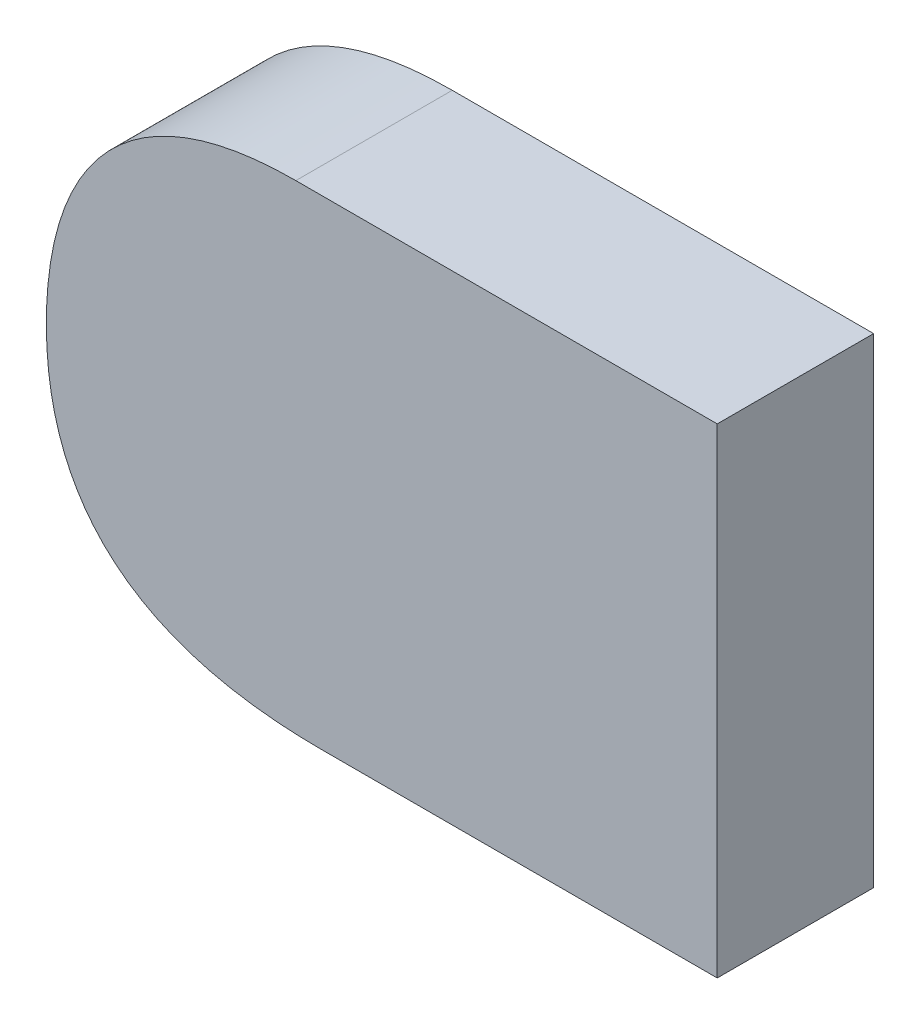
ISO-10303-21;
HEADER;
FILE_DESCRIPTION(('STEP AP214'),'2;1');
FILE_NAME('part.step','',(''),(''),'','','');
FILE_SCHEMA(('AUTOMOTIVE_DESIGN { 1 0 10303 214 1 1 1 1 }'));
ENDSEC;
DATA;
#1=APPLICATION_CONTEXT('core data for automotive mechanical design processes');
#2=APPLICATION_PROTOCOL_DEFINITION('international standard','automotive_design',2000,#1);
#3=PRODUCT_CONTEXT('',#1,'mechanical');
#4=PRODUCT('Part','Part','',(#3));
#5=PRODUCT_RELATED_PRODUCT_CATEGORY('part','',(#4));
#6=PRODUCT_DEFINITION_FORMATION('','',#4);
#7=PRODUCT_DEFINITION_CONTEXT('part definition',#1,'design');
#8=PRODUCT_DEFINITION('design','',#6,#7);
#9=PRODUCT_DEFINITION_SHAPE('','',#8);
#10=(LENGTH_UNIT() NAMED_UNIT(*) SI_UNIT(.MILLI.,.METRE.));
#11=(NAMED_UNIT(*) PLANE_ANGLE_UNIT() SI_UNIT($,.RADIAN.));
#12=(NAMED_UNIT(*) SI_UNIT($,.STERADIAN.) SOLID_ANGLE_UNIT());
#13=UNCERTAINTY_MEASURE_WITH_UNIT(LENGTH_MEASURE(1.E-05),#10,'distance_accuracy_value','');
#14=(GEOMETRIC_REPRESENTATION_CONTEXT(3) GLOBAL_UNCERTAINTY_ASSIGNED_CONTEXT((#13)) GLOBAL_UNIT_ASSIGNED_CONTEXT((#10,
#11,#12)) REPRESENTATION_CONTEXT('',''));
#15=CARTESIAN_POINT('',(0.,0.,0.));
#16=DIRECTION('',(0.,0.,1.));
#17=DIRECTION('',(1.,0.,0.));
#18=AXIS2_PLACEMENT_3D('',#15,#16,#17);
#19=CARTESIAN_POINT('',(-24.24255021043,3.656604873158,19.2));
#20=DIRECTION('',(0.,0.,1.));
#21=DIRECTION('',(1.,0.,0.));
#22=AXIS2_PLACEMENT_3D('',#19,#20,#21);
#23=PLANE('',#22);
#24=DIRECTION('',(1.,0.,0.));
#25=VECTOR('',#24,1.);
#26=CARTESIAN_POINT('',(-24.71358248636,2.134115071921,19.2));
#27=LINE('',#26,#25);
#28=CARTESIAN_POINT('',(-24.71358248636,2.134115071921,19.2));
#29=VERTEX_POINT('',#28);
#30=CARTESIAN_POINT('',(-22.18731541969,2.13411538542482,19.2));
#31=VERTEX_POINT('',#30);
#32=EDGE_CURVE('E27',#29,#31,#27,.T.);
#33=ORIENTED_EDGE('',*,*,#32,.F.);
#34=CARTESIAN_POINT('',(35.2406784290266,53.8203882570304,19.2));
#35=DIRECTION('',(0.,0.,1.));
#36=DIRECTION('',(0.768285049798114,0.640107867672871,0.));
#37=AXIS2_PLACEMENT_3D('',#34,#35,#36);
#38=ELLIPSE('',#37,79.943656208256,9.46145339615795);
#39=CARTESIAN_POINT('',(-26.47671219747,3.607464649699,19.2));
#40=VERTEX_POINT('',#39);
#41=EDGE_CURVE('E93',#40,#29,#38,.T.);
#42=ORIENTED_EDGE('',*,*,#41,.F.);
#43=CARTESIAN_POINT('',(-24.88156115303,5.202285494143,19.2));
#44=CARTESIAN_POINT('',(-25.94122939747,5.202285494143,19.2));
#45=CARTESIAN_POINT('',(-26.47671219747,4.581726805254,19.2));
#46=CARTESIAN_POINT('',(-26.47671219747,3.607464649699,19.2));
#47=(BOUNDED_CURVE() B_SPLINE_CURVE(3,(#43,#44,#45,#46),.UNSPECIFIED.,.F.,
.F.) B_SPLINE_CURVE_WITH_KNOTS((4,4),(0.,1.),
.UNSPECIFIED.) CURVE() GEOMETRIC_REPRESENTATION_ITEM() RATIONAL_B_SPLINE_CURVE((1.,1.,1.,1.)) REPRESENTATION_ITEM(''));
#48=CARTESIAN_POINT('',(-24.88156115303,5.202285494143,19.2));
#49=VERTEX_POINT('',#48);
#50=EDGE_CURVE('E91',#49,#40,#47,.T.);
#51=ORIENTED_EDGE('',*,*,#50,.F.);
#52=DIRECTION('',(-1.,0.,0.));
#53=VECTOR('',#52,1.);
#54=CARTESIAN_POINT('',(-22.18731541969,5.202285494143,19.2));
#55=LINE('',#54,#53);
#56=CARTESIAN_POINT('',(-22.18731541969,5.202285494143,19.2));
#57=VERTEX_POINT('',#56);
#58=EDGE_CURVE('E56',#57,#49,#55,.T.);
#59=ORIENTED_EDGE('',*,*,#58,.F.);
#60=DIRECTION('',(0.,1.,0.));
#61=VECTOR('',#60,1.);
#62=CARTESIAN_POINT('',(-22.18731541969,2.134117894143,19.2));
#63=LINE('',#62,#61);
#64=EDGE_CURVE('E120',#31,#57,#63,.T.);
#65=ORIENTED_EDGE('',*,*,#64,.F.);
#66=EDGE_LOOP('',(#33,#42,#51,#59,#65));
#67=FACE_BOUND('',#66,.T.);
#68=ADVANCED_FACE('F16',(#67),#23,.F.);
#69=CARTESIAN_POINT('',(-24.24255021043,3.656604873158,20.2));
#70=DIRECTION('',(0.,0.,1.));
#71=DIRECTION('',(1.,0.,0.));
#72=AXIS2_PLACEMENT_3D('',#69,#70,#71);
#73=PLANE('',#72);
#74=DIRECTION('',(0.,1.,0.));
#75=VECTOR('',#74,1.);
#76=CARTESIAN_POINT('',(-22.18731541969,2.134117894143,20.2));
#77=LINE('',#76,#75);
#78=CARTESIAN_POINT('',(-22.18731541969,2.13411538542467,20.2));
#79=VERTEX_POINT('',#78);
#80=CARTESIAN_POINT('',(-22.18731541969,5.202285494143,20.2));
#81=VERTEX_POINT('',#80);
#82=EDGE_CURVE('E108',#79,#81,#77,.T.);
#83=ORIENTED_EDGE('',*,*,#82,.T.);
#84=DIRECTION('',(-1.,0.,0.));
#85=VECTOR('',#84,1.);
#86=CARTESIAN_POINT('',(-22.18731541969,5.202285494143,20.2));
#87=LINE('',#86,#85);
#88=CARTESIAN_POINT('',(-24.88156115303,5.202285494143,20.2));
#89=VERTEX_POINT('',#88);
#90=EDGE_CURVE('E97',#81,#89,#87,.T.);
#91=ORIENTED_EDGE('',*,*,#90,.T.);
#92=CARTESIAN_POINT('',(-24.88156115303,5.202285494143,20.2));
#93=CARTESIAN_POINT('',(-25.94122939747,5.202285494143,20.2));
#94=CARTESIAN_POINT('',(-26.47671219747,4.581726805254,20.2));
#95=CARTESIAN_POINT('',(-26.47671219747,3.607464649699,20.2));
#96=(BOUNDED_CURVE() B_SPLINE_CURVE(3,(#92,#93,#94,#95),.UNSPECIFIED.,.F.,
.F.) B_SPLINE_CURVE_WITH_KNOTS((4,4),(0.,1.),
.UNSPECIFIED.) CURVE() GEOMETRIC_REPRESENTATION_ITEM() RATIONAL_B_SPLINE_CURVE((1.,1.,1.,1.)) REPRESENTATION_ITEM(''));
#97=CARTESIAN_POINT('',(-26.47671219747,3.607464649699,20.2));
#98=VERTEX_POINT('',#97);
#99=EDGE_CURVE('E86',#89,#98,#96,.T.);
#100=ORIENTED_EDGE('',*,*,#99,.T.);
#101=CARTESIAN_POINT('',(35.240678429014,53.8203882570192,20.2));
#102=DIRECTION('',(0.,0.,1.));
#103=DIRECTION('',(0.768285049798118,0.640107867672866,0.));
#104=AXIS2_PLACEMENT_3D('',#101,#102,#103);
#105=ELLIPSE('',#104,79.9436562082391,9.46145339615692);
#106=CARTESIAN_POINT('',(-24.71358248636,2.134115071921,20.2));
#107=VERTEX_POINT('',#106);
#108=EDGE_CURVE('E129',#98,#107,#105,.T.);
#109=ORIENTED_EDGE('',*,*,#108,.T.);
#110=DIRECTION('',(1.,0.,0.));
#111=VECTOR('',#110,1.);
#112=CARTESIAN_POINT('',(-24.71358248636,2.134115071921,20.2));
#113=LINE('',#112,#111);
#114=EDGE_CURVE('E11',#107,#79,#113,.T.);
#115=ORIENTED_EDGE('',*,*,#114,.T.);
#116=EDGE_LOOP('',(#83,#91,#100,#109,#115));
#117=FACE_BOUND('',#116,.T.);
#118=ADVANCED_FACE('F146',(#117),#73,.T.);
#119=CARTESIAN_POINT('',(-23.450448953025,2.134115071921,19.19));
#120=DIRECTION('',(0.,-1.,0.));
#121=DIRECTION('',(0.,0.,-1.));
#122=AXIS2_PLACEMENT_3D('',#119,#120,#121);
#123=PLANE('',#122);
#124=DIRECTION('',(0.,0.,-1.));
#125=VECTOR('',#124,1.);
#126=CARTESIAN_POINT('',(-24.71358248636,2.134115071921,20.2));
#127=LINE('',#126,#125);
#128=EDGE_CURVE('E20',#107,#29,#127,.T.);
#129=ORIENTED_EDGE('',*,*,#128,.T.);
#130=ORIENTED_EDGE('',*,*,#32,.T.);
#131=DIRECTION('',(0.,0.,-1.));
#132=VECTOR('',#131,1.);
#133=CARTESIAN_POINT('',(-22.18731541969,2.134115071921,19.19));
#134=LINE('',#133,#132);
#135=EDGE_CURVE('E116',#79,#31,#134,.T.);
#136=ORIENTED_EDGE('',*,*,#135,.F.);
#137=ORIENTED_EDGE('',*,*,#114,.F.);
#138=EDGE_LOOP('',(#129,#130,#136,#137));
#139=FACE_BOUND('',#138,.T.);
#140=ADVANCED_FACE('F160',(#139),#123,.T.);
#141=CARTESIAN_POINT('',(-26.4767122632415,3.60846483149296,20.2));
#142=CARTESIAN_POINT('',(-26.4767965214315,3.00544825202406,20.2));
#143=CARTESIAN_POINT('',(-26.1788374619767,2.6478249475906,20.2));
#144=CARTESIAN_POINT('',(-25.7499904021539,2.13310422417631,20.2));
#145=CARTESIAN_POINT('',(-24.7125823354989,2.13411592695536,20.2));
#146=CARTESIAN_POINT('',(-26.4767122632415,3.60846483149296,19.2));
#147=CARTESIAN_POINT('',(-26.4767965214315,3.00544825202406,19.2));
#148=CARTESIAN_POINT('',(-26.1788374619767,2.6478249475906,19.2));
#149=CARTESIAN_POINT('',(-25.7499904021539,2.13310422417631,19.2));
#150=CARTESIAN_POINT('',(-24.7125823354989,2.13411592695536,19.2));
#151=(BOUNDED_SURFACE() B_SPLINE_SURFACE(1,2,((#141,#142,#143,#144,#145),(#146,#147,#148,#149,
#150)),.UNSPECIFIED.,.F.,.F.,.F.) B_SPLINE_SURFACE_WITH_KNOTS((2,2),(3,2,3),
(-0.0125213187323008,-1.2508809922377E-05),(493.738254443276,502.30080608539,514.517552625195),
.UNSPECIFIED.) GEOMETRIC_REPRESENTATION_ITEM() RATIONAL_B_SPLINE_SURFACE(((0.962780754645472,
0.980028594170412,1.,0.971505502884951,0.948555254073968),(0.962780754645472,0.980028594170412,
1.,0.971505502884951,0.948555254073968))) REPRESENTATION_ITEM('') SURFACE());
#152=DIRECTION('',(0.,0.,-1.));
#153=VECTOR('',#152,1.);
#154=CARTESIAN_POINT('',(-26.47671219747,3.607464649699,20.2));
#155=LINE('',#154,#153);
#156=EDGE_CURVE('E96',#98,#40,#155,.T.);
#157=ORIENTED_EDGE('',*,*,#156,.T.);
#158=ORIENTED_EDGE('',*,*,#41,.T.);
#159=ORIENTED_EDGE('',*,*,#128,.F.);
#160=ORIENTED_EDGE('',*,*,#108,.F.);
#161=EDGE_LOOP('',(#157,#158,#159,#160));
#162=FACE_BOUND('',#161,.T.);
#163=ADVANCED_FACE('F149',(#162),#151,.T.);
#164=CARTESIAN_POINT('',(-24.88156115303,5.202285494143,19.199));
#165=CARTESIAN_POINT('',(-24.88156115303,5.202285494143,20.201));
#166=CARTESIAN_POINT('',(-25.94122939747,5.202285494143,19.199));
#167=CARTESIAN_POINT('',(-25.94122939747,5.202285494143,20.201));
#168=CARTESIAN_POINT('',(-26.47671219747,4.581726805254,19.199));
#169=CARTESIAN_POINT('',(-26.47671219747,4.581726805254,20.201));
#170=CARTESIAN_POINT('',(-26.47671219747,3.607464649699,19.199));
#171=CARTESIAN_POINT('',(-26.47671219747,3.607464649699,20.201));
#172=(BOUNDED_SURFACE() B_SPLINE_SURFACE(3,1,((#164,#165),(#166,#167),(#168,#169),(#170,#171)),
.UNSPECIFIED.,.F.,.F.,.F.) B_SPLINE_SURFACE_WITH_KNOTS((4,4),(2,2),(0.,1.),(-1.001,0.001),
.UNSPECIFIED.) GEOMETRIC_REPRESENTATION_ITEM() RATIONAL_B_SPLINE_SURFACE(((1.,1.),(1.,1.),(1.,
1.),(1.,1.))) REPRESENTATION_ITEM('') SURFACE());
#173=DIRECTION('',(0.,0.,-1.));
#174=VECTOR('',#173,1.);
#175=CARTESIAN_POINT('',(-24.88156115303,5.202285494143,20.2));
#176=LINE('',#175,#174);
#177=EDGE_CURVE('E100',#89,#49,#176,.T.);
#178=ORIENTED_EDGE('',*,*,#177,.T.);
#179=ORIENTED_EDGE('',*,*,#50,.T.);
#180=ORIENTED_EDGE('',*,*,#156,.F.);
#181=ORIENTED_EDGE('',*,*,#99,.F.);
#182=EDGE_LOOP('',(#178,#179,#180,#181));
#183=FACE_BOUND('',#182,.T.);
#184=ADVANCED_FACE('F101',(#183),#172,.T.);
#185=CARTESIAN_POINT('',(-23.53443828636,5.202285494143,19.19));
#186=DIRECTION('',(0.,1.,0.));
#187=DIRECTION('',(1.,0.,0.));
#188=AXIS2_PLACEMENT_3D('',#185,#186,#187);
#189=PLANE('',#188);
#190=DIRECTION('',(0.,0.,-1.));
#191=VECTOR('',#190,1.);
#192=CARTESIAN_POINT('',(-22.18731541969,5.202285494143,20.2));
#193=LINE('',#192,#191);
#194=EDGE_CURVE('E105',#81,#57,#193,.T.);
#195=ORIENTED_EDGE('',*,*,#194,.T.);
#196=ORIENTED_EDGE('',*,*,#58,.T.);
#197=ORIENTED_EDGE('',*,*,#177,.F.);
#198=ORIENTED_EDGE('',*,*,#90,.F.);
#199=EDGE_LOOP('',(#195,#196,#197,#198));
#200=FACE_BOUND('',#199,.T.);
#201=ADVANCED_FACE('F18',(#200),#189,.T.);
#202=CARTESIAN_POINT('',(-22.18731541969,3.668201694143,19.19));
#203=DIRECTION('',(1.,0.,0.));
#204=DIRECTION('',(0.,1.,0.));
#205=AXIS2_PLACEMENT_3D('',#202,#203,#204);
#206=PLANE('',#205);
#207=ORIENTED_EDGE('',*,*,#135,.T.);
#208=ORIENTED_EDGE('',*,*,#64,.T.);
#209=ORIENTED_EDGE('',*,*,#194,.F.);
#210=ORIENTED_EDGE('',*,*,#82,.F.);
#211=EDGE_LOOP('',(#207,#208,#209,#210));
#212=FACE_BOUND('',#211,.T.);
#213=ADVANCED_FACE('F199',(#212),#206,.T.);
#214=CLOSED_SHELL('',(#68,#118,#140,#163,#184,#201,#213));
#215=MANIFOLD_SOLID_BREP('B1',#214);
#216=ADVANCED_BREP_SHAPE_REPRESENTATION('',(#18,#215),#14);
#217=SHAPE_DEFINITION_REPRESENTATION(#9,#216);
ENDSEC;
END-ISO-10303-21;
